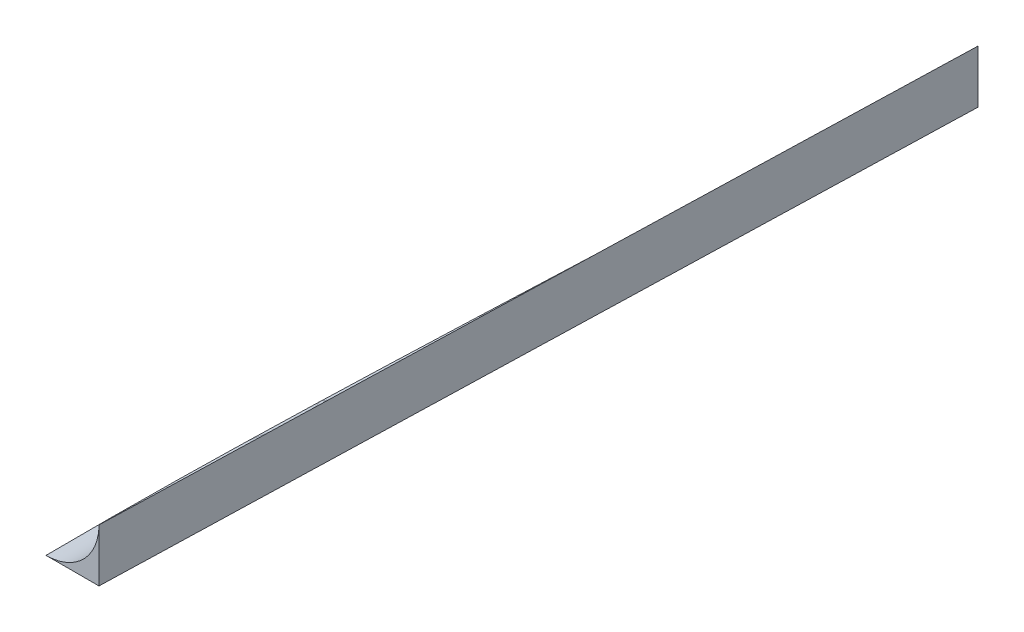
ISO-10303-21;
HEADER;
FILE_DESCRIPTION(('STEP AP214'),'2;1');
FILE_NAME('part.step','',(''),(''),'','','');
FILE_SCHEMA(('AUTOMOTIVE_DESIGN { 1 0 10303 214 1 1 1 1 }'));
ENDSEC;
DATA;
#1=APPLICATION_CONTEXT('core data for automotive mechanical design processes');
#2=APPLICATION_PROTOCOL_DEFINITION('international standard','automotive_design',2000,#1);
#3=PRODUCT_CONTEXT('',#1,'mechanical');
#4=PRODUCT('Part','Part','',(#3));
#5=PRODUCT_RELATED_PRODUCT_CATEGORY('part','',(#4));
#6=PRODUCT_DEFINITION_FORMATION('','',#4);
#7=PRODUCT_DEFINITION_CONTEXT('part definition',#1,'design');
#8=PRODUCT_DEFINITION('design','',#6,#7);
#9=PRODUCT_DEFINITION_SHAPE('','',#8);
#10=(LENGTH_UNIT() NAMED_UNIT(*) SI_UNIT(.MILLI.,.METRE.));
#11=(NAMED_UNIT(*) PLANE_ANGLE_UNIT() SI_UNIT($,.RADIAN.));
#12=(NAMED_UNIT(*) SI_UNIT($,.STERADIAN.) SOLID_ANGLE_UNIT());
#13=UNCERTAINTY_MEASURE_WITH_UNIT(LENGTH_MEASURE(1.E-05),#10,'distance_accuracy_value','');
#14=(GEOMETRIC_REPRESENTATION_CONTEXT(3) GLOBAL_UNCERTAINTY_ASSIGNED_CONTEXT((#13)) GLOBAL_UNIT_ASSIGNED_CONTEXT((#10,
#11,#12)) REPRESENTATION_CONTEXT('',''));
#15=CARTESIAN_POINT('',(0.,0.,0.));
#16=DIRECTION('',(0.,0.,1.));
#17=DIRECTION('',(1.,0.,0.));
#18=AXIS2_PLACEMENT_3D('',#15,#16,#17);
#19=CARTESIAN_POINT('',(-208.968256040362,-4.73904484835474,-1034.43578931657));
#20=DIRECTION('',(0.,7.65540464451725E-12,1.));
#21=DIRECTION('',(0.,-1.,7.65540464451725E-12));
#22=AXIS2_PLACEMENT_3D('',#19,#20,#21);
#23=PLANE('',#22);
#24=CARTESIAN_POINT('',(-171.93575290472,85.1731166534426,-1034.43578931657));
#25=CARTESIAN_POINT('',(-171.936215112842,84.1427720175834,-1034.43578931657));
#26=CARTESIAN_POINT('',(-171.952618550226,82.08239656169,-1034.43578931656));
#27=CARTESIAN_POINT('',(-172.061067287097,78.9936511860136,-1034.43578931657));
#28=CARTESIAN_POINT('',(-172.241205030327,75.9063071534556,-1034.43578931656));
#29=CARTESIAN_POINT('',(-172.583686074143,71.7923597978552,-1034.43578931657));
#30=CARTESIAN_POINT('',(-173.201906742766,66.652294879117,-1034.43578931656));
#31=CARTESIAN_POINT('',(-174.249730978542,60.4959455039909,-1034.43578931657));
#32=CARTESIAN_POINT('',(-175.615561015107,54.3313149535897,-1034.43578931656));
#33=CARTESIAN_POINT('',(-177.27233043202,48.2911202795295,-1034.43578931657));
#34=CARTESIAN_POINT('',(-179.214614012736,42.3671215814294,-1034.43578931656));
#35=CARTESIAN_POINT('',(-181.439388115655,36.5604447714491,-1034.43578931657));
#36=CARTESIAN_POINT('',(-183.947067017834,30.8678590151382,-1034.43578931656));
#37=CARTESIAN_POINT('',(-187.660155982669,23.4368793004746,-1034.43578931657));
#38=CARTESIAN_POINT('',(-193.046812254888,14.404205207297,-1034.43578931656));
#39=CARTESIAN_POINT('',(-200.491080031706,4.34353443083546,-1034.43578931657));
#40=CARTESIAN_POINT('',(-208.804094642751,-4.86189884175419,-1034.43578931656));
#41=CARTESIAN_POINT('',(-218.08274212468,-13.3101587131408,-1034.43578931657));
#42=CARTESIAN_POINT('',(-228.195397756534,-20.8234146212055,-1034.43578931656));
#43=CARTESIAN_POINT('',(-238.848203752941,-27.2150547177463,-1034.43578931657));
#44=CARTESIAN_POINT('',(-250.09908767537,-32.5617451404458,-1034.43578931656));
#45=CARTESIAN_POINT('',(-261.99183385504,-36.8265015620229,-1034.43578931657));
#46=CARTESIAN_POINT('',(-274.093339126946,-39.8537314691061,-1034.43578931656));
#47=CARTESIAN_POINT('',(-286.392084173679,-41.6863484446972,-1034.43578931656));
#48=CARTESIAN_POINT('',(-294.731325080749,-42.1017036225334,-1034.43578931656));
#49=CARTESIAN_POINT('',(-298.935805766758,-42.1017055402725,-1034.43578931656));
#50=B_SPLINE_CURVE_WITH_KNOTS('',3,(#24,#25,#26,#27,#28,#29,#30,#31,#32,#33,#34,#35,#36,#37,#38,
#39,#40,#41,#42,#43,#44,#45,#46,#47,#48,#49),.UNSPECIFIED.,.F.,.F.,(4,1,1,1,1,1,1,1,1,1,1,1,1,1,
1,1,1,1,1,1,1,1,1,4),(0.,0.015625,0.03125,0.046875,0.0625,0.09375,0.125,0.15625,0.1875,0.21875,
0.25,0.28125,0.3125,0.375,0.4375,0.5,0.5625,0.625,0.6875,0.75,0.8125,0.875,0.9375,1.),.UNSPECIFIED.);
#51=CARTESIAN_POINT('',(-298.935805766758,-42.1017055402725,-1034.43578931656));
#52=VERTEX_POINT('',#51);
#53=CARTESIAN_POINT('',(-171.93575290472,85.1731166534426,-1034.43578931657));
#54=VERTEX_POINT('',#53);
#55=EDGE_CURVE('E211',#52,#54,#50,.F.);
#56=ORIENTED_EDGE('',*,*,#55,.T.);
#57=CARTESIAN_POINT('',(-171.93575290472,85.1731166534426,-1034.43578931725));
#58=DIRECTION('',(0.,-1.,7.65533755708637E-12));
#59=VECTOR('',#58,1.);
#60=LINE('',#57,#59);
#61=CARTESIAN_POINT('',(-171.935752904718,-42.1017055402725,-1034.43578931656));
#62=VERTEX_POINT('',#61);
#63=EDGE_CURVE('E105',#54,#62,#60,.T.);
#64=ORIENTED_EDGE('',*,*,#63,.T.);
#65=CARTESIAN_POINT('',(-298.935805766758,-42.1017055402725,-1034.43578931656));
#66=CARTESIAN_POINT('',(-171.935752904718,-42.1017055402725,-1034.43578931656));
#67=B_SPLINE_CURVE_WITH_KNOTS('',1,(#65,#66),.UNSPECIFIED.,.F.,.F.,(2,2),(0.,1.),.UNSPECIFIED.);
#68=EDGE_CURVE('E13',#52,#62,#67,.T.);
#69=ORIENTED_EDGE('',*,*,#68,.F.);
#70=EDGE_LOOP('',(#56,#64,#69));
#71=FACE_BOUND('',#70,.T.);
#72=ADVANCED_FACE('F94',(#71),#23,.F.);
#73=CARTESIAN_POINT('',(-269.288079484812,-5.09369915401733,1018.63579113815));
#74=DIRECTION('',(-1.96659644894699E-09,2.10454517093014E-12,-1.));
#75=DIRECTION('',(1.,0.,-1.96659644894699E-09));
#76=AXIS2_PLACEMENT_3D('',#73,#74,#75);
#77=PLANE('',#76);
#78=CARTESIAN_POINT('',(-231.990658934935,-42.3595962759614,1018.63579113815));
#79=CARTESIAN_POINT('',(-359.323797976204,-42.3595962759614,1018.63579113815));
#80=B_SPLINE_CURVE_WITH_KNOTS('',1,(#78,#79),.UNSPECIFIED.,.F.,.F.,(2,2),(0.,1.),.UNSPECIFIED.);
#81=CARTESIAN_POINT('',(-359.323797976204,-42.3595962759614,1018.63579113815));
#82=VERTEX_POINT('',#81);
#83=CARTESIAN_POINT('',(-231.990658934935,-42.3595962759614,1018.63579113815));
#84=VERTEX_POINT('',#83);
#85=EDGE_CURVE('E160',#82,#84,#80,.F.);
#86=ORIENTED_EDGE('',*,*,#85,.T.);
#87=CARTESIAN_POINT('',(-231.990658934935,84.7757386869262,1018.63579113815));
#88=DIRECTION('',(0.,-1.,0.));
#89=VECTOR('',#88,1.);
#90=LINE('',#87,#89);
#91=CARTESIAN_POINT('',(-231.990658934935,84.7757386869262,1018.63579113815));
#92=VERTEX_POINT('',#91);
#93=EDGE_CURVE('E136',#92,#84,#90,.T.);
#94=ORIENTED_EDGE('',*,*,#93,.F.);
#95=CARTESIAN_POINT('',(-359.323797976204,-42.3595962759614,1018.63579113815));
#96=CARTESIAN_POINT('',(-355.122898988511,-42.3586245236828,1018.63579113815));
#97=CARTESIAN_POINT('',(-346.775573878496,-41.9436588357074,1018.63579113815));
#98=CARTESIAN_POINT('',(-334.348667206623,-40.0947488017867,1018.63579113815));
#99=CARTESIAN_POINT('',(-322.136940800983,-37.0218554002117,1018.63579113815));
#100=CARTESIAN_POINT('',(-310.449054417565,-32.8219419028585,1018.63579113815));
#101=CARTESIAN_POINT('',(-299.201808827458,-27.5120250387761,1018.63579113815));
#102=CARTESIAN_POINT('',(-288.383388079646,-21.0274157113722,1018.63579113815));
#103=CARTESIAN_POINT('',(-278.355043388576,-13.579076048945,1018.63579113815));
#104=CARTESIAN_POINT('',(-269.165950630788,-5.25848837225477,1018.63579113815));
#105=CARTESIAN_POINT('',(-260.727857056149,4.03165970492552,1018.63579113815));
#106=CARTESIAN_POINT('',(-253.237351760466,14.1342596881234,1018.63579113815));
#107=CARTESIAN_POINT('',(-247.923534049018,23.0006805067411,1018.63579113815));
#108=CARTESIAN_POINT('',(-244.1943080697,30.3912133636574,1018.63579113815));
#109=CARTESIAN_POINT('',(-241.661851758854,36.0894311055866,1018.63579113815));
#110=CARTESIAN_POINT('',(-239.397407700374,41.9495869449886,1018.63579113815));
#111=CARTESIAN_POINT('',(-237.421463338903,47.9173094683129,1018.63579113815));
#112=CARTESIAN_POINT('',(-235.754506119081,53.9382272620088,1018.63579113815));
#113=CARTESIAN_POINT('',(-234.391346309547,60.0084785500463,1018.63579113815));
#114=CARTESIAN_POINT('',(-233.32679417894,66.1242015563958,1018.63579113815));
#115=CARTESIAN_POINT('',(-232.689265006633,71.2609164450571,1018.63579113815));
#116=CARTESIAN_POINT('',(-232.329454953162,75.3958873568743,1018.63579113815));
#117=CARTESIAN_POINT('',(-232.135680197855,78.5096011685636,1018.63579113815));
#118=CARTESIAN_POINT('',(-232.018964369955,81.6354867354615,1018.63579113815));
#119=CARTESIAN_POINT('',(-231.991780591745,83.7276079519457,1018.63579113815));
#120=CARTESIAN_POINT('',(-231.990658934935,84.7757386869291,1018.63579113815));
#121=B_SPLINE_CURVE_WITH_KNOTS('',3,(#95,#96,#97,#98,#99,#100,#101,#102,#103,#104,#105,#106,
#107,#108,#109,#110,#111,#112,#113,#114,#115,#116,#117,#118,#119,#120),.UNSPECIFIED.,.F.,.F.,(4,
1,1,1,1,1,1,1,1,1,1,1,1,1,1,1,1,1,1,1,1,1,1,4),(0.,0.0625,0.125,0.1875,0.25,0.3125,0.375,0.4375,
0.5,0.5625,0.625,0.6875,0.71875,0.75,0.78125,0.8125,0.84375,0.875,0.90625,0.9375,0.953125,
0.96875,0.984375,1.),.UNSPECIFIED.);
#122=EDGE_CURVE('E146',#92,#82,#121,.F.);
#123=ORIENTED_EDGE('',*,*,#122,.T.);
#124=EDGE_LOOP('',(#86,#94,#123));
#125=FACE_BOUND('',#124,.T.);
#126=ADVANCED_FACE('F159',(#125),#77,.F.);
#127=CARTESIAN_POINT('',(-231.990658934935,84.7757386869291,1018.63579113815));
#128=CARTESIAN_POINT('',(-211.972356924863,84.9081980090982,334.278597653245));
#129=CARTESIAN_POINT('',(-191.954054914792,85.0406573312705,-350.078595831661));
#130=CARTESIAN_POINT('',(-171.93575290472,85.1731166534426,-1034.43578931657));
#131=CARTESIAN_POINT('',(-231.991780591745,83.7276079519457,1018.63579113815));
#132=CARTESIAN_POINT('',(-212.288216043306,83.6868227557834,334.264269728454));
#133=CARTESIAN_POINT('',(-192.146754043686,83.7886183441973,-350.096016113137));
#134=CARTESIAN_POINT('',(-171.936215112842,84.1427720175834,-1034.43578931657));
#135=CARTESIAN_POINT('',(-232.018964369955,81.6354867354615,1018.63579113815));
#136=CARTESIAN_POINT('',(-212.941720930296,81.246937023417,334.235613878875));
#137=CARTESIAN_POINT('',(-192.550785137097,81.2861296650951,-350.130856676085));
#138=CARTESIAN_POINT('',(-171.952618550226,82.08239656169,-1034.43578931656));
#139=CARTESIAN_POINT('',(-232.135680197855,78.5096011685636,1018.63579113815));
#140=CARTESIAN_POINT('',(-214.000552894771,77.595911866141,334.192630104504));
#141=CARTESIAN_POINT('',(-193.238040884606,77.5377072711604,-350.183117520513));
#142=CARTESIAN_POINT('',(-172.061067287097,78.9936511860136,-1034.43578931657));
#143=CARTESIAN_POINT('',(-232.329454953162,75.3958873568743,1018.63579113815));
#144=CARTESIAN_POINT('',(-215.134653812969,73.9534683267101,334.149646330135));
#145=CARTESIAN_POINT('',(-193.998775612156,73.7942763577075,-350.235378364937));
#146=CARTESIAN_POINT('',(-172.241205030327,75.9063071534556,-1034.43578931656));
#147=CARTESIAN_POINT('',(-232.689265006633,71.2609164450571,1018.63579113815));
#148=CARTESIAN_POINT('',(-216.748516641334,69.1088123948069,334.092334630975));
#149=CARTESIAN_POINT('',(-195.115101410695,68.8102585440111,-350.30505949084));
#150=CARTESIAN_POINT('',(-172.583686074143,71.7923597978552,-1034.43578931657));
#151=CARTESIAN_POINT('',(-233.32679417894,66.1242015563958,1018.63579113815));
#152=CARTESIAN_POINT('',(-218.954396035053,63.0751147392556,334.020695007024));
#153=CARTESIAN_POINT('',(-196.699843769926,62.5924820444356,-350.392160898216));
#154=CARTESIAN_POINT('',(-173.201906742766,66.652294879117,-1034.43578931656));
#155=CARTESIAN_POINT('',(-234.391346309547,60.0084785500463,1018.63579113815));
#156=CARTESIAN_POINT('',(-221.903115867884,55.8708103017432,333.934727458282));
#157=CARTESIAN_POINT('',(-198.905346597902,55.1550808831994,-350.496682587068));
#158=CARTESIAN_POINT('',(-174.249730978542,60.4959455039909,-1034.43578931657));
#159=CARTESIAN_POINT('',(-235.754506119081,53.9382272620088,1018.63579113815));
#160=CARTESIAN_POINT('',(-225.156909420263,48.6940599513471,333.848759909543));
#161=CARTESIAN_POINT('',(-201.422389186046,47.7273161778838,-350.601204275919));
#162=CARTESIAN_POINT('',(-175.615561015107,54.3313149535897,-1034.43578931656));
#163=CARTESIAN_POINT('',(-237.421463338903,47.9173094683129,1018.63579113815));
#164=CARTESIAN_POINT('',(-228.71021437295,41.5916772226258,333.762792360804));
#165=CARTESIAN_POINT('',(-204.234657164518,40.3989532215761,-350.705725964771));
#166=CARTESIAN_POINT('',(-177.27233043202,48.2911202795295,-1034.43578931657));
#167=CARTESIAN_POINT('',(-239.397407700374,41.9495869449886,1018.63579113815));
#168=CARTESIAN_POINT('',(-232.564682141338,34.5634899994723,333.676824812064));
#169=CARTESIAN_POINT('',(-207.340263632743,33.1657860060324,-350.810247653621));
#170=CARTESIAN_POINT('',(-179.214614012736,42.3671215814294,-1034.43578931656));
#171=CARTESIAN_POINT('',(-241.661851758854,36.0894311055866,1018.63579113815));
#172=CARTESIAN_POINT('',(-236.705646548466,27.6461211949735,333.590857263323));
#173=CARTESIAN_POINT('',(-210.730363681438,26.0466889438759,-350.914769342475));
#174=CARTESIAN_POINT('',(-181.439388115655,36.5604447714491,-1034.43578931657));
#175=CARTESIAN_POINT('',(-244.1943080697,30.3912133636574,1018.63579113815));
#176=CARTESIAN_POINT('',(-241.119587390257,20.8747414733464,333.504889714582));
#177=CARTESIAN_POINT('',(-214.398404347095,19.05763194999,-351.019291031326));
#178=CARTESIAN_POINT('',(-183.947067017834,30.8678590151382,-1034.43578931656));
#179=CARTESIAN_POINT('',(-247.923534049018,23.0006805067411,1018.63579113815));
#180=CARTESIAN_POINT('',(-247.363092587638,12.0373405861979,333.390266316261));
#181=CARTESIAN_POINT('',(-219.6530091531,9.91400930919466,-351.15865328313));
#182=CARTESIAN_POINT('',(-187.660155982669,23.4368793004746,-1034.43578931657));
#183=CARTESIAN_POINT('',(-253.237351760466,14.1342596881234,1018.63579113815));
#184=CARTESIAN_POINT('',(-255.850762597956,1.32376982899804,333.246987068364));
#185=CARTESIAN_POINT('',(-226.935556950489,-1.22090354085559,-351.33285609788));
#186=CARTESIAN_POINT('',(-193.046812254888,14.404205207297,-1034.43578931656));
#187=CARTESIAN_POINT('',(-260.727857056149,4.03165970492552,1018.63579113815));
#188=CARTESIAN_POINT('',(-267.105342721687,-10.9149323684291,333.075051970882));
#189=CARTESIAN_POINT('',(-236.699442488108,-13.8847385376338,-351.541899475585));
#190=CARTESIAN_POINT('',(-200.491080031706,4.34353443083546,-1034.43578931657));
#191=CARTESIAN_POINT('',(-269.165950630788,-5.25848837225477,1018.63579113815));
#192=CARTESIAN_POINT('',(-279.281230642798,-22.3269207938872,332.903116873401));
#193=CARTESIAN_POINT('',(-247.35835534153,-25.7075978964915,-351.750942853287));
#194=CARTESIAN_POINT('',(-208.804094642751,-4.86189884175419,-1034.43578931656));
#195=CARTESIAN_POINT('',(-278.355043388576,-13.579076048945,1018.63579113815));
#196=CARTESIAN_POINT('',(-292.279662309636,-32.8401444852842,332.731181775921));
#197=CARTESIAN_POINT('',(-258.911356503258,-36.7024881877172,-351.959986230992));
#198=CARTESIAN_POINT('',(-218.08274212468,-13.3101587131408,-1034.43578931657));
#199=CARTESIAN_POINT('',(-288.383388079646,-21.0274157113722,1018.63579113815));
#200=CARTESIAN_POINT('',(-306.11559798197,-42.4602015127319,332.559246678442));
#201=CARTESIAN_POINT('',(-271.300113742696,-46.7832931653073,-352.169029608692));
#202=CARTESIAN_POINT('',(-228.195397756534,-20.8234146212055,-1034.43578931656));
#203=CARTESIAN_POINT('',(-299.201808827458,-27.5120250387761,1018.63579113815));
#204=CARTESIAN_POINT('',(-320.658301146983,-51.0638997129894,332.38731158096));
#205=CARTESIAN_POINT('',(-284.312329910751,-55.7951108235403,-352.3780729864));
#206=CARTESIAN_POINT('',(-238.848203752941,-27.2150547177463,-1034.43578931657));
#207=CARTESIAN_POINT('',(-310.449054417565,-32.8219419028585,1018.63579113815));
#208=CARTESIAN_POINT('',(-335.686246848867,-58.5361530464188,332.215376483483));
#209=CARTESIAN_POINT('',(-297.866206310252,-63.7187312114386,-352.587116364099));
#210=CARTESIAN_POINT('',(-250.09908767537,-32.5617451404458,-1034.43578931656));
#211=CARTESIAN_POINT('',(-322.136940800983,-37.0218554002117,1018.63579113815));
#212=CARTESIAN_POINT('',(-351.221907165372,-64.9077594683213,332.043441386));
#213=CARTESIAN_POINT('',(-311.994871145683,-70.5510611430122,-352.796159741805));
#214=CARTESIAN_POINT('',(-261.99183385504,-36.8265015620229,-1034.43578931657));
#215=CARTESIAN_POINT('',(-334.348667206623,-40.0947488017867,1018.63579113815));
#216=CARTESIAN_POINT('',(-367.176380527436,-70.1155103215404,331.871506288521));
#217=CARTESIAN_POINT('',(-326.437322050013,-76.1827000329972,-353.005203119507));
#218=CARTESIAN_POINT('',(-274.093339126946,-39.8537314691061,-1034.43578931656));
#219=CARTESIAN_POINT('',(-346.775573878496,-41.9436588357074,1018.63579113815));
#220=CARTESIAN_POINT('',(-383.340053991932,-74.1090679524926,331.69957119104));
#221=CARTESIAN_POINT('',(-341.082992892972,-80.6099358461027,-353.21424649721));
#222=CARTESIAN_POINT('',(-286.392084173679,-41.6863484446972,-1034.43578931656));
#223=CARTESIAN_POINT('',(-355.122898988511,-42.3586245236828,1018.63579113815));
#224=CARTESIAN_POINT('',(-394.204342590523,-75.9575492147379,331.584947792722));
#225=CARTESIAN_POINT('',(-350.961065370699,-82.7512864060328,-353.35360874901));
#226=CARTESIAN_POINT('',(-294.731325080749,-42.1017036225334,-1034.43578931656));
#227=CARTESIAN_POINT('',(-359.323797976204,-42.3595962759614,1018.63579113815));
#228=CARTESIAN_POINT('',(-399.6662645891,-76.674890560995,331.527636093562));
#229=CARTESIAN_POINT('',(-355.93242057544,-83.6146742079754,-353.423289874911));
#230=CARTESIAN_POINT('',(-298.935805766758,-42.1017055402725,-1034.43578931656));
#231=B_SPLINE_SURFACE_WITH_KNOTS('',3,3,((#127,#128,#129,#130),(#131,#132,#133,#134),(#135,#136,
#137,#138),(#139,#140,#141,#142),(#143,#144,#145,#146),(#147,#148,#149,#150),(#151,#152,#153,
#154),(#155,#156,#157,#158),(#159,#160,#161,#162),(#163,#164,#165,#166),(#167,#168,#169,#170),
(#171,#172,#173,#174),(#175,#176,#177,#178),(#179,#180,#181,#182),(#183,#184,#185,#186),(#187,
#188,#189,#190),(#191,#192,#193,#194),(#195,#196,#197,#198),(#199,#200,#201,#202),(#203,#204,
#205,#206),(#207,#208,#209,#210),(#211,#212,#213,#214),(#215,#216,#217,#218),(#219,#220,#221,
#222),(#223,#224,#225,#226),(#227,#228,#229,#230)),.UNSPECIFIED.,.F.,.F.,.F.,(4,1,1,1,1,1,1,1,1,
1,1,1,1,1,1,1,1,1,1,1,1,1,1,4),(4,4),(0.,0.015625,0.03125,0.046875,0.0625,0.09375,0.125,0.15625,
0.1875,0.21875,0.25,0.28125,0.3125,0.375,0.4375,0.5,0.5625,0.625,0.6875,0.75,0.8125,0.875,
0.9375,1.),(0.,1.),.UNSPECIFIED.);
#232=CARTESIAN_POINT('',(-231.990658934935,84.7757386869291,1018.63579113815));
#233=CARTESIAN_POINT('',(-211.972356924863,84.9081980090982,334.278597653245));
#234=CARTESIAN_POINT('',(-191.954054914792,85.0406573312705,-350.078595831661));
#235=CARTESIAN_POINT('',(-171.93575290472,85.1731166534426,-1034.43578931657));
#236=B_SPLINE_CURVE_WITH_KNOTS('',3,(#232,#233,#234,#235),.UNSPECIFIED.,.F.,.F.,(4,4),(0.,1.),.UNSPECIFIED.);
#237=EDGE_CURVE('E131',#54,#92,#236,.F.);
#238=CARTESIAN_POINT('',(-359.323797976204,-42.3595962759614,1018.63579113815));
#239=CARTESIAN_POINT('',(-399.6662645891,-76.674890560995,331.527636093562));
#240=CARTESIAN_POINT('',(-355.93242057544,-83.6146742079754,-353.423289874911));
#241=CARTESIAN_POINT('',(-298.935805766758,-42.1017055402725,-1034.43578931656));
#242=B_SPLINE_CURVE_WITH_KNOTS('',3,(#238,#239,#240,#241),.UNSPECIFIED.,.F.,.F.,(4,4),(0.,1.),.UNSPECIFIED.);
#243=EDGE_CURVE('E111',#82,#52,#242,.T.);
#244=ORIENTED_EDGE('',*,*,#122,.F.);
#245=ORIENTED_EDGE('',*,*,#237,.F.);
#246=ORIENTED_EDGE('',*,*,#55,.F.);
#247=ORIENTED_EDGE('',*,*,#243,.F.);
#248=EDGE_LOOP('',(#244,#245,#246,#247));
#249=FACE_BOUND('',#248,.T.);
#250=ADVANCED_FACE('F151',(#249),#231,.F.);
#251=CARTESIAN_POINT('',(-231.990658934935,-42.3595962759614,1018.63579113815));
#252=CARTESIAN_POINT('',(-211.972356924863,-42.2736326973984,334.278597653246));
#253=CARTESIAN_POINT('',(-191.954054914791,-42.1876691188355,-350.078595831658));
#254=CARTESIAN_POINT('',(-171.935752904718,-42.1017055402725,-1034.43578931656));
#255=CARTESIAN_POINT('',(-359.323797976204,-42.3595962759614,1018.63579113815));
#256=CARTESIAN_POINT('',(-399.6662645891,-76.674890560995,331.527636093562));
#257=CARTESIAN_POINT('',(-355.93242057544,-83.6146742079754,-353.423289874911));
#258=CARTESIAN_POINT('',(-298.935805766758,-42.1017055402725,-1034.43578931656));
#259=B_SPLINE_SURFACE_WITH_KNOTS('',1,3,((#251,#252,#253,#254),(#255,#256,#257,#258)),
.UNSPECIFIED.,.F.,.F.,.F.,(2,2),(4,4),(0.,1.),(0.,1.),.UNSPECIFIED.);
#260=CARTESIAN_POINT('',(-171.935752904718,-42.1017055402725,-1034.43578931656));
#261=CARTESIAN_POINT('',(-191.954054914791,-42.1876691188355,-350.078595831658));
#262=CARTESIAN_POINT('',(-211.972356924863,-42.2736326973984,334.278597653246));
#263=CARTESIAN_POINT('',(-231.990658934935,-42.3595962759614,1018.63579113815));
#264=B_SPLINE_CURVE_WITH_KNOTS('',3,(#260,#261,#262,#263),.UNSPECIFIED.,.F.,.F.,(4,4),(0.,1.),.UNSPECIFIED.);
#265=EDGE_CURVE('E120',#84,#62,#264,.F.);
#266=ORIENTED_EDGE('',*,*,#265,.F.);
#267=ORIENTED_EDGE('',*,*,#85,.F.);
#268=ORIENTED_EDGE('',*,*,#243,.T.);
#269=ORIENTED_EDGE('',*,*,#68,.T.);
#270=EDGE_LOOP('',(#266,#267,#268,#269));
#271=FACE_BOUND('',#270,.T.);
#272=ADVANCED_FACE('F237',(#271),#259,.T.);
#273=CARTESIAN_POINT('',(-202.24711273084,1.04034891750131E-12,1.80580254666796));
#274=DIRECTION('',(0.999572456590682,0.,0.0292387418550934));
#275=DIRECTION('',(-0.0292387418550934,0.,0.999572456590682));
#276=AXIS2_PLACEMENT_3D('',#273,#274,#275);
#277=PLANE('',#276);
#278=ORIENTED_EDGE('',*,*,#237,.T.);
#279=ORIENTED_EDGE('',*,*,#93,.T.);
#280=ORIENTED_EDGE('',*,*,#265,.T.);
#281=ORIENTED_EDGE('',*,*,#63,.F.);
#282=EDGE_LOOP('',(#278,#279,#280,#281));
#283=FACE_BOUND('',#282,.T.);
#284=ADVANCED_FACE('F134',(#283),#277,.T.);
#285=CLOSED_SHELL('',(#72,#126,#250,#272,#284));
#286=MANIFOLD_SOLID_BREP('B2',#285);
#287=ADVANCED_BREP_SHAPE_REPRESENTATION('',(#18,#286),#14);
#288=SHAPE_DEFINITION_REPRESENTATION(#9,#287);
ENDSEC;
END-ISO-10303-21;
